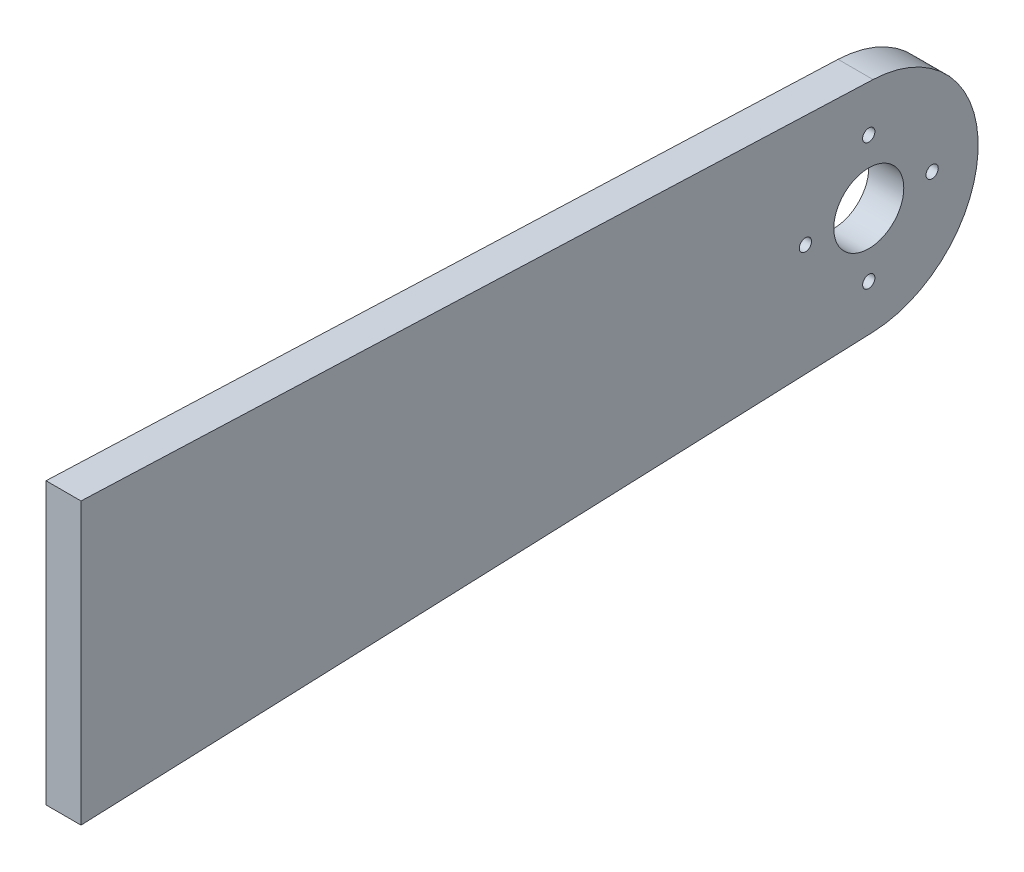
ISO-10303-21;
HEADER;
FILE_DESCRIPTION(('STEP AP214'),'2;1');
FILE_NAME('part.step','',(''),(''),'','','');
FILE_SCHEMA(('AUTOMOTIVE_DESIGN { 1 0 10303 214 1 1 1 1 }'));
ENDSEC;
DATA;
#1=APPLICATION_CONTEXT('core data for automotive mechanical design processes');
#2=APPLICATION_PROTOCOL_DEFINITION('international standard','automotive_design',2000,#1);
#3=PRODUCT_CONTEXT('',#1,'mechanical');
#4=PRODUCT('Part','Part','',(#3));
#5=PRODUCT_RELATED_PRODUCT_CATEGORY('part','',(#4));
#6=PRODUCT_DEFINITION_FORMATION('','',#4);
#7=PRODUCT_DEFINITION_CONTEXT('part definition',#1,'design');
#8=PRODUCT_DEFINITION('design','',#6,#7);
#9=PRODUCT_DEFINITION_SHAPE('','',#8);
#10=(LENGTH_UNIT() NAMED_UNIT(*) SI_UNIT(.MILLI.,.METRE.));
#11=(NAMED_UNIT(*) PLANE_ANGLE_UNIT() SI_UNIT($,.RADIAN.));
#12=(NAMED_UNIT(*) SI_UNIT($,.STERADIAN.) SOLID_ANGLE_UNIT());
#13=UNCERTAINTY_MEASURE_WITH_UNIT(LENGTH_MEASURE(1.E-05),#10,'distance_accuracy_value','');
#14=(GEOMETRIC_REPRESENTATION_CONTEXT(3) GLOBAL_UNCERTAINTY_ASSIGNED_CONTEXT((#13)) GLOBAL_UNIT_ASSIGNED_CONTEXT((#10,
#11,#12)) REPRESENTATION_CONTEXT('',''));
#15=CARTESIAN_POINT('',(0.,0.,0.));
#16=DIRECTION('',(0.,0.,1.));
#17=DIRECTION('',(1.,0.,0.));
#18=AXIS2_PLACEMENT_3D('',#15,#16,#17);
#19=CARTESIAN_POINT('',(4.,0.,0.));
#20=DIRECTION('',(1.,0.,0.));
#21=DIRECTION('',(0.,0.,-1.));
#22=AXIS2_PLACEMENT_3D('',#19,#20,#21);
#23=PLANE('',#22);
#24=CARTESIAN_POINT('',(4.,0.,-7.24));
#25=DIRECTION('',(1.,0.,0.));
#26=DIRECTION('',(0.,0.,-1.));
#27=AXIS2_PLACEMENT_3D('',#24,#25,#26);
#28=CIRCLE('',#27,0.700000000000001);
#29=CARTESIAN_POINT('',(4.,0.,-7.94));
#30=VERTEX_POINT('',#29);
#31=EDGE_CURVE('E128',#30,#30,#28,.T.);
#32=ORIENTED_EDGE('',*,*,#31,.F.);
#33=EDGE_LOOP('',(#32));
#34=FACE_BOUND('',#33,.T.);
#35=CARTESIAN_POINT('',(4.,0.,7.24));
#36=DIRECTION('',(1.,0.,0.));
#37=DIRECTION('',(0.,0.,-1.));
#38=AXIS2_PLACEMENT_3D('',#35,#36,#37);
#39=CIRCLE('',#38,0.7);
#40=CARTESIAN_POINT('',(4.,0.,6.54));
#41=VERTEX_POINT('',#40);
#42=EDGE_CURVE('E116',#41,#41,#39,.T.);
#43=ORIENTED_EDGE('',*,*,#42,.F.);
#44=EDGE_LOOP('',(#43));
#45=FACE_BOUND('',#44,.T.);
#46=DIRECTION('',(0.,0.0391869580785522,0.999231896166525));
#47=VECTOR('',#46,1.);
#48=CARTESIAN_POINT('',(4.,16.0391459565646,90.));
#49=LINE('',#48,#47);
#50=CARTESIAN_POINT('',(4.,12.4903987020816,-0.48983697598192));
#51=VERTEX_POINT('',#50);
#52=CARTESIAN_POINT('',(4.,16.0391459565646,90.));
#53=VERTEX_POINT('',#52);
#54=EDGE_CURVE('E86',#51,#53,#49,.T.);
#55=ORIENTED_EDGE('',*,*,#54,.T.);
#56=DIRECTION('',(0.,-1.,0.));
#57=VECTOR('',#56,1.);
#58=CARTESIAN_POINT('',(4.,16.0391459565646,90.));
#59=LINE('',#58,#57);
#60=CARTESIAN_POINT('',(4.,-16.0391459565648,90.));
#61=VERTEX_POINT('',#60);
#62=EDGE_CURVE('E81',#53,#61,#59,.T.);
#63=ORIENTED_EDGE('',*,*,#62,.T.);
#64=DIRECTION('',(0.,0.039186958078554,-0.999231896166525));
#65=VECTOR('',#64,1.);
#66=CARTESIAN_POINT('',(4.,-16.0391459565648,90.));
#67=LINE('',#66,#65);
#68=CARTESIAN_POINT('',(4.,-12.4903987020816,-0.489836975981916));
#69=VERTEX_POINT('',#68);
#70=EDGE_CURVE('E84',#61,#69,#67,.T.);
#71=ORIENTED_EDGE('',*,*,#70,.T.);
#72=CARTESIAN_POINT('',(4.,0.,0.));
#73=DIRECTION('',(1.,0.,0.));
#74=DIRECTION('',(0.,0.,-1.));
#75=AXIS2_PLACEMENT_3D('',#72,#73,#74);
#76=CIRCLE('',#75,12.5);
#77=EDGE_CURVE('E51',#69,#51,#76,.T.);
#78=ORIENTED_EDGE('',*,*,#77,.T.);
#79=EDGE_LOOP('',(#55,#63,#71,#78));
#80=FACE_BOUND('',#79,.T.);
#81=CARTESIAN_POINT('',(4.,0.,0.));
#82=DIRECTION('',(1.,0.,0.));
#83=DIRECTION('',(0.,0.,-1.));
#84=AXIS2_PLACEMENT_3D('',#81,#82,#83);
#85=CIRCLE('',#84,4.);
#86=CARTESIAN_POINT('',(4.,0.,-4.));
#87=VERTEX_POINT('',#86);
#88=EDGE_CURVE('E101',#87,#87,#85,.T.);
#89=ORIENTED_EDGE('',*,*,#88,.F.);
#90=EDGE_LOOP('',(#89));
#91=FACE_BOUND('',#90,.T.);
#92=CARTESIAN_POINT('',(4.,7.24,0.));
#93=DIRECTION('',(1.,0.,0.));
#94=DIRECTION('',(0.,0.,-1.));
#95=AXIS2_PLACEMENT_3D('',#92,#93,#94);
#96=CIRCLE('',#95,0.7);
#97=CARTESIAN_POINT('',(4.,7.24,-0.699999999999999));
#98=VERTEX_POINT('',#97);
#99=EDGE_CURVE('E122',#98,#98,#96,.T.);
#100=ORIENTED_EDGE('',*,*,#99,.F.);
#101=EDGE_LOOP('',(#100));
#102=FACE_BOUND('',#101,.T.);
#103=CARTESIAN_POINT('',(4.,-7.24,0.));
#104=DIRECTION('',(1.,0.,0.));
#105=DIRECTION('',(0.,0.,-1.));
#106=AXIS2_PLACEMENT_3D('',#103,#104,#105);
#107=CIRCLE('',#106,0.7);
#108=CARTESIAN_POINT('',(4.,-7.24,-0.700000000000001));
#109=VERTEX_POINT('',#108);
#110=EDGE_CURVE('E134',#109,#109,#107,.T.);
#111=ORIENTED_EDGE('',*,*,#110,.F.);
#112=EDGE_LOOP('',(#111));
#113=FACE_BOUND('',#112,.T.);
#114=ADVANCED_FACE('F34',(#34,#45,#80,#91,#102,#113),#23,.T.);
#115=CARTESIAN_POINT('',(0.,0.,0.));
#116=DIRECTION('',(1.,0.,0.));
#117=DIRECTION('',(0.,0.,-1.));
#118=AXIS2_PLACEMENT_3D('',#115,#116,#117);
#119=PLANE('',#118);
#120=DIRECTION('',(0.,0.0391869580785522,0.999231896166525));
#121=VECTOR('',#120,1.);
#122=CARTESIAN_POINT('',(0.,16.0391459565646,90.));
#123=LINE('',#122,#121);
#124=CARTESIAN_POINT('',(0.,12.4903987020816,-0.48983697598192));
#125=VERTEX_POINT('',#124);
#126=CARTESIAN_POINT('',(0.,16.0391459565646,90.));
#127=VERTEX_POINT('',#126);
#128=EDGE_CURVE('E98',#125,#127,#123,.T.);
#129=ORIENTED_EDGE('',*,*,#128,.F.);
#130=CARTESIAN_POINT('',(0.,0.,0.));
#131=DIRECTION('',(1.,0.,0.));
#132=DIRECTION('',(0.,0.,-1.));
#133=AXIS2_PLACEMENT_3D('',#130,#131,#132);
#134=CIRCLE('',#133,12.5);
#135=CARTESIAN_POINT('',(0.,-12.4903987020816,-0.489836975981916));
#136=VERTEX_POINT('',#135);
#137=EDGE_CURVE('E74',#136,#125,#134,.T.);
#138=ORIENTED_EDGE('',*,*,#137,.F.);
#139=DIRECTION('',(0.,0.039186958078554,-0.999231896166525));
#140=VECTOR('',#139,1.);
#141=CARTESIAN_POINT('',(0.,-16.0391459565648,90.));
#142=LINE('',#141,#140);
#143=CARTESIAN_POINT('',(0.,-16.0391459565648,90.));
#144=VERTEX_POINT('',#143);
#145=EDGE_CURVE('E68',#144,#136,#142,.T.);
#146=ORIENTED_EDGE('',*,*,#145,.F.);
#147=DIRECTION('',(0.,-1.,0.));
#148=VECTOR('',#147,1.);
#149=CARTESIAN_POINT('',(0.,16.0391459565646,90.));
#150=LINE('',#149,#148);
#151=EDGE_CURVE('E90',#127,#144,#150,.T.);
#152=ORIENTED_EDGE('',*,*,#151,.F.);
#153=EDGE_LOOP('',(#129,#138,#146,#152));
#154=FACE_BOUND('',#153,.T.);
#155=CARTESIAN_POINT('',(0.,0.,0.));
#156=DIRECTION('',(1.,0.,0.));
#157=DIRECTION('',(0.,0.,-1.));
#158=AXIS2_PLACEMENT_3D('',#155,#156,#157);
#159=CIRCLE('',#158,4.);
#160=CARTESIAN_POINT('',(0.,0.,-4.));
#161=VERTEX_POINT('',#160);
#162=EDGE_CURVE('E113',#161,#161,#159,.T.);
#163=ORIENTED_EDGE('',*,*,#162,.T.);
#164=EDGE_LOOP('',(#163));
#165=FACE_BOUND('',#164,.T.);
#166=CARTESIAN_POINT('',(0.,0.,7.24));
#167=DIRECTION('',(1.,0.,0.));
#168=DIRECTION('',(0.,0.,-1.));
#169=AXIS2_PLACEMENT_3D('',#166,#167,#168);
#170=CIRCLE('',#169,0.7);
#171=CARTESIAN_POINT('',(0.,0.,6.54));
#172=VERTEX_POINT('',#171);
#173=EDGE_CURVE('E119',#172,#172,#170,.T.);
#174=ORIENTED_EDGE('',*,*,#173,.T.);
#175=EDGE_LOOP('',(#174));
#176=FACE_BOUND('',#175,.T.);
#177=CARTESIAN_POINT('',(0.,7.24,0.));
#178=DIRECTION('',(1.,0.,0.));
#179=DIRECTION('',(0.,0.,-1.));
#180=AXIS2_PLACEMENT_3D('',#177,#178,#179);
#181=CIRCLE('',#180,0.7);
#182=CARTESIAN_POINT('',(0.,7.24,-0.699999999999999));
#183=VERTEX_POINT('',#182);
#184=EDGE_CURVE('E125',#183,#183,#181,.T.);
#185=ORIENTED_EDGE('',*,*,#184,.T.);
#186=EDGE_LOOP('',(#185));
#187=FACE_BOUND('',#186,.T.);
#188=CARTESIAN_POINT('',(0.,0.,-7.24));
#189=DIRECTION('',(1.,0.,0.));
#190=DIRECTION('',(0.,0.,-1.));
#191=AXIS2_PLACEMENT_3D('',#188,#189,#190);
#192=CIRCLE('',#191,0.700000000000001);
#193=CARTESIAN_POINT('',(0.,0.,-7.94));
#194=VERTEX_POINT('',#193);
#195=EDGE_CURVE('E131',#194,#194,#192,.T.);
#196=ORIENTED_EDGE('',*,*,#195,.T.);
#197=EDGE_LOOP('',(#196));
#198=FACE_BOUND('',#197,.T.);
#199=CARTESIAN_POINT('',(0.,-7.24,0.));
#200=DIRECTION('',(1.,0.,0.));
#201=DIRECTION('',(0.,0.,-1.));
#202=AXIS2_PLACEMENT_3D('',#199,#200,#201);
#203=CIRCLE('',#202,0.7);
#204=CARTESIAN_POINT('',(0.,-7.24,-0.700000000000001));
#205=VERTEX_POINT('',#204);
#206=EDGE_CURVE('E137',#205,#205,#203,.T.);
#207=ORIENTED_EDGE('',*,*,#206,.T.);
#208=EDGE_LOOP('',(#207));
#209=FACE_BOUND('',#208,.T.);
#210=ADVANCED_FACE('F109',(#154,#165,#176,#187,#198,#209),#119,.F.);
#211=CARTESIAN_POINT('',(4.,16.0391459565646,90.));
#212=DIRECTION('',(0.,-0.999231896166526,0.0391869580785522));
#213=DIRECTION('',(0.,-0.0391869580785522,-0.999231896166526));
#214=AXIS2_PLACEMENT_3D('',#211,#212,#213);
#215=PLANE('',#214);
#216=ORIENTED_EDGE('',*,*,#128,.T.);
#217=DIRECTION('',(-1.,0.,0.));
#218=VECTOR('',#217,1.);
#219=CARTESIAN_POINT('',(4.,16.0391459565646,90.));
#220=LINE('',#219,#218);
#221=EDGE_CURVE('E11',#53,#127,#220,.T.);
#222=ORIENTED_EDGE('',*,*,#221,.F.);
#223=ORIENTED_EDGE('',*,*,#54,.F.);
#224=DIRECTION('',(-1.,0.,0.));
#225=VECTOR('',#224,1.);
#226=CARTESIAN_POINT('',(4.,12.4903987020816,-0.48983697598192));
#227=LINE('',#226,#225);
#228=EDGE_CURVE('E94',#51,#125,#227,.T.);
#229=ORIENTED_EDGE('',*,*,#228,.T.);
#230=EDGE_LOOP('',(#216,#222,#223,#229));
#231=FACE_BOUND('',#230,.T.);
#232=ADVANCED_FACE('F36',(#231),#215,.F.);
#233=CARTESIAN_POINT('',(4.,16.0391459565646,90.));
#234=DIRECTION('',(0.,0.,-1.));
#235=DIRECTION('',(-1.,0.,0.));
#236=AXIS2_PLACEMENT_3D('',#233,#234,#235);
#237=PLANE('',#236);
#238=ORIENTED_EDGE('',*,*,#151,.T.);
#239=DIRECTION('',(-1.,0.,0.));
#240=VECTOR('',#239,1.);
#241=CARTESIAN_POINT('',(4.,-16.0391459565648,90.));
#242=LINE('',#241,#240);
#243=EDGE_CURVE('E43',#61,#144,#242,.T.);
#244=ORIENTED_EDGE('',*,*,#243,.F.);
#245=ORIENTED_EDGE('',*,*,#62,.F.);
#246=ORIENTED_EDGE('',*,*,#221,.T.);
#247=EDGE_LOOP('',(#238,#244,#245,#246));
#248=FACE_BOUND('',#247,.T.);
#249=ADVANCED_FACE('F89',(#248),#237,.F.);
#250=CARTESIAN_POINT('',(4.,-16.0391459565648,90.));
#251=DIRECTION('',(0.,0.999231896166525,0.039186958078554));
#252=DIRECTION('',(0.,-0.039186958078554,0.999231896166526));
#253=AXIS2_PLACEMENT_3D('',#250,#251,#252);
#254=PLANE('',#253);
#255=ORIENTED_EDGE('',*,*,#145,.T.);
#256=DIRECTION('',(-1.,0.,0.));
#257=VECTOR('',#256,1.);
#258=CARTESIAN_POINT('',(4.,-12.4903987020816,-0.489836975981916));
#259=LINE('',#258,#257);
#260=EDGE_CURVE('E91',#69,#136,#259,.T.);
#261=ORIENTED_EDGE('',*,*,#260,.F.);
#262=ORIENTED_EDGE('',*,*,#70,.F.);
#263=ORIENTED_EDGE('',*,*,#243,.T.);
#264=EDGE_LOOP('',(#255,#261,#262,#263));
#265=FACE_BOUND('',#264,.T.);
#266=ADVANCED_FACE('F92',(#265),#254,.F.);
#267=CARTESIAN_POINT('',(4.,0.,0.));
#268=DIRECTION('',(-1.,0.,0.));
#269=DIRECTION('',(0.,0.,1.));
#270=AXIS2_PLACEMENT_3D('',#267,#268,#269);
#271=CYLINDRICAL_SURFACE('',#270,12.5);
#272=ORIENTED_EDGE('',*,*,#137,.T.);
#273=ORIENTED_EDGE('',*,*,#228,.F.);
#274=ORIENTED_EDGE('',*,*,#77,.F.);
#275=ORIENTED_EDGE('',*,*,#260,.T.);
#276=EDGE_LOOP('',(#272,#273,#274,#275));
#277=FACE_BOUND('',#276,.T.);
#278=ADVANCED_FACE('F106',(#277),#271,.T.);
#279=CARTESIAN_POINT('',(4.,0.,0.));
#280=DIRECTION('',(-1.,0.,0.));
#281=DIRECTION('',(0.,0.,1.));
#282=AXIS2_PLACEMENT_3D('',#279,#280,#281);
#283=CYLINDRICAL_SURFACE('',#282,4.);
#284=ORIENTED_EDGE('',*,*,#88,.T.);
#285=EDGE_LOOP('',(#284));
#286=FACE_BOUND('',#285,.T.);
#287=ORIENTED_EDGE('',*,*,#162,.F.);
#288=EDGE_LOOP('',(#287));
#289=FACE_BOUND('',#288,.T.);
#290=ADVANCED_FACE('F156',(#286,#289),#283,.F.);
#291=CARTESIAN_POINT('',(4.,0.,7.24));
#292=DIRECTION('',(-1.,0.,0.));
#293=DIRECTION('',(0.,0.,1.));
#294=AXIS2_PLACEMENT_3D('',#291,#292,#293);
#295=CYLINDRICAL_SURFACE('',#294,0.7);
#296=ORIENTED_EDGE('',*,*,#42,.T.);
#297=EDGE_LOOP('',(#296));
#298=FACE_BOUND('',#297,.T.);
#299=ORIENTED_EDGE('',*,*,#173,.F.);
#300=EDGE_LOOP('',(#299));
#301=FACE_BOUND('',#300,.T.);
#302=ADVANCED_FACE('F202',(#298,#301),#295,.F.);
#303=CARTESIAN_POINT('',(4.,7.24,0.));
#304=DIRECTION('',(-1.,0.,0.));
#305=DIRECTION('',(0.,0.,1.));
#306=AXIS2_PLACEMENT_3D('',#303,#304,#305);
#307=CYLINDRICAL_SURFACE('',#306,0.7);
#308=ORIENTED_EDGE('',*,*,#99,.T.);
#309=EDGE_LOOP('',(#308));
#310=FACE_BOUND('',#309,.T.);
#311=ORIENTED_EDGE('',*,*,#184,.F.);
#312=EDGE_LOOP('',(#311));
#313=FACE_BOUND('',#312,.T.);
#314=ADVANCED_FACE('F210',(#310,#313),#307,.F.);
#315=CARTESIAN_POINT('',(4.,0.,-7.24));
#316=DIRECTION('',(-1.,0.,0.));
#317=DIRECTION('',(0.,0.,1.));
#318=AXIS2_PLACEMENT_3D('',#315,#316,#317);
#319=CYLINDRICAL_SURFACE('',#318,0.700000000000001);
#320=ORIENTED_EDGE('',*,*,#31,.T.);
#321=EDGE_LOOP('',(#320));
#322=FACE_BOUND('',#321,.T.);
#323=ORIENTED_EDGE('',*,*,#195,.F.);
#324=EDGE_LOOP('',(#323));
#325=FACE_BOUND('',#324,.T.);
#326=ADVANCED_FACE('F218',(#322,#325),#319,.F.);
#327=CARTESIAN_POINT('',(4.,-7.24,0.));
#328=DIRECTION('',(-1.,0.,0.));
#329=DIRECTION('',(0.,0.,1.));
#330=AXIS2_PLACEMENT_3D('',#327,#328,#329);
#331=CYLINDRICAL_SURFACE('',#330,0.7);
#332=ORIENTED_EDGE('',*,*,#110,.T.);
#333=EDGE_LOOP('',(#332));
#334=FACE_BOUND('',#333,.T.);
#335=ORIENTED_EDGE('',*,*,#206,.F.);
#336=EDGE_LOOP('',(#335));
#337=FACE_BOUND('',#336,.T.);
#338=ADVANCED_FACE('F143',(#334,#337),#331,.F.);
#339=CLOSED_SHELL('',(#114,#210,#232,#249,#266,#278,#290,#302,#314,#326,#338));
#340=MANIFOLD_SOLID_BREP('B2',#339);
#341=ADVANCED_BREP_SHAPE_REPRESENTATION('',(#18,#340),#14);
#342=SHAPE_DEFINITION_REPRESENTATION(#9,#341);
ENDSEC;
END-ISO-10303-21;
